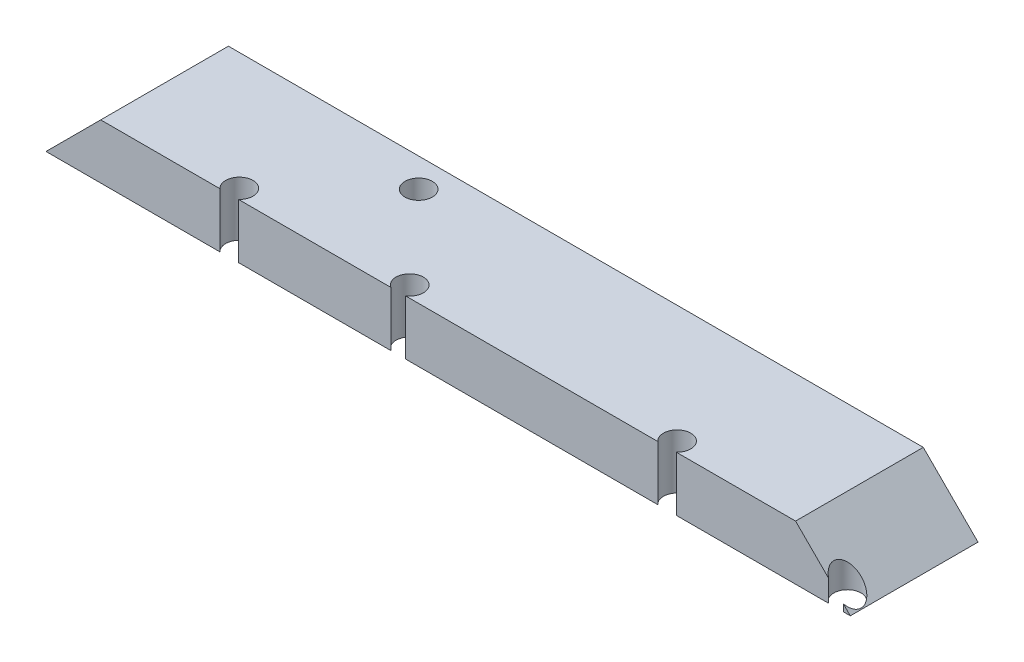
ISO-10303-21;
HEADER;
FILE_DESCRIPTION(('STEP AP214'),'2;1');
FILE_NAME('part.step','',(''),(''),'','','');
FILE_SCHEMA(('AUTOMOTIVE_DESIGN { 1 0 10303 214 1 1 1 1 }'));
ENDSEC;
DATA;
#1=APPLICATION_CONTEXT('core data for automotive mechanical design processes');
#2=APPLICATION_PROTOCOL_DEFINITION('international standard','automotive_design',2000,#1);
#3=PRODUCT_CONTEXT('',#1,'mechanical');
#4=PRODUCT('Part','Part','',(#3));
#5=PRODUCT_RELATED_PRODUCT_CATEGORY('part','',(#4));
#6=PRODUCT_DEFINITION_FORMATION('','',#4);
#7=PRODUCT_DEFINITION_CONTEXT('part definition',#1,'design');
#8=PRODUCT_DEFINITION('design','',#6,#7);
#9=PRODUCT_DEFINITION_SHAPE('','',#8);
#10=(LENGTH_UNIT() NAMED_UNIT(*) SI_UNIT(.MILLI.,.METRE.));
#11=(NAMED_UNIT(*) PLANE_ANGLE_UNIT() SI_UNIT($,.RADIAN.));
#12=(NAMED_UNIT(*) SI_UNIT($,.STERADIAN.) SOLID_ANGLE_UNIT());
#13=UNCERTAINTY_MEASURE_WITH_UNIT(LENGTH_MEASURE(1.E-05),#10,'distance_accuracy_value','');
#14=(GEOMETRIC_REPRESENTATION_CONTEXT(3) GLOBAL_UNCERTAINTY_ASSIGNED_CONTEXT((#13)) GLOBAL_UNIT_ASSIGNED_CONTEXT((#10,
#11,#12)) REPRESENTATION_CONTEXT('',''));
#15=CARTESIAN_POINT('',(0.,0.,0.));
#16=DIRECTION('',(0.,0.,1.));
#17=DIRECTION('',(1.,0.,0.));
#18=AXIS2_PLACEMENT_3D('',#15,#16,#17);
#19=CARTESIAN_POINT('',(0.,38.1,0.));
#20=DIRECTION('',(0.,0.,-1.));
#21=DIRECTION('',(-1.,0.,0.));
#22=AXIS2_PLACEMENT_3D('',#19,#20,#21);
#23=PLANE('',#22);
#24=DIRECTION('',(1.,0.,0.));
#25=VECTOR('',#24,1.);
#26=CARTESIAN_POINT('',(0.,0.,0.));
#27=LINE('',#26,#25);
#28=CARTESIAN_POINT('',(250.338601463434,0.,0.));
#29=VERTEX_POINT('',#28);
#30=CARTESIAN_POINT('',(425.940462477857,0.,0.));
#31=VERTEX_POINT('',#30);
#32=EDGE_CURVE('E171',#29,#31,#27,.T.);
#33=ORIENTED_EDGE('',*,*,#32,.T.);
#34=DIRECTION('',(0.,1.,0.));
#35=VECTOR('',#34,1.);
#36=CARTESIAN_POINT('',(425.940462477857,-0.001000000000001,0.));
#37=LINE('',#36,#35);
#38=CARTESIAN_POINT('',(425.940462477857,38.1,0.));
#39=VERTEX_POINT('',#38);
#40=EDGE_CURVE('E56',#39,#31,#37,.F.);
#41=ORIENTED_EDGE('',*,*,#40,.F.);
#42=DIRECTION('',(1.,0.,0.));
#43=VECTOR('',#42,1.);
#44=CARTESIAN_POINT('',(0.,38.1,0.));
#45=LINE('',#44,#43);
#46=CARTESIAN_POINT('',(250.338601463434,38.1,0.));
#47=VERTEX_POINT('',#46);
#48=EDGE_CURVE('E151',#47,#39,#45,.T.);
#49=ORIENTED_EDGE('',*,*,#48,.F.);
#50=DIRECTION('',(0.,1.,0.));
#51=VECTOR('',#50,1.);
#52=CARTESIAN_POINT('',(250.338601463434,-0.001000000000001,0.));
#53=LINE('',#52,#51);
#54=EDGE_CURVE('E196',#29,#47,#53,.T.);
#55=ORIENTED_EDGE('',*,*,#54,.F.);
#56=EDGE_LOOP('',(#33,#41,#49,#55));
#57=FACE_BOUND('',#56,.T.);
#58=ADVANCED_FACE('F31',(#57),#23,.F.);
#59=DIRECTION('',(0.,1.,0.));
#60=VECTOR('',#59,1.);
#61=CARTESIAN_POINT('',(544.861398536567,-0.001000000000001,0.));
#62=LINE('',#61,#60);
#63=CARTESIAN_POINT('',(544.861398536567,15.1386014634335,0.));
#64=VERTEX_POINT('',#63);
#65=CARTESIAN_POINT('',(544.861398536567,0.,0.));
#66=VERTEX_POINT('',#65);
#67=EDGE_CURVE('E200',#64,#66,#62,.F.);
#68=ORIENTED_EDGE('',*,*,#67,.F.);
#69=DIRECTION('',(0.707106781186548,-0.707106781186547,0.));
#70=VECTOR('',#69,1.);
#71=CARTESIAN_POINT('',(560.,0.,0.));
#72=LINE('',#71,#70);
#73=CARTESIAN_POINT('',(521.9,38.1,0.));
#74=VERTEX_POINT('',#73);
#75=EDGE_CURVE('E48',#74,#64,#72,.T.);
#76=ORIENTED_EDGE('',*,*,#75,.F.);
#77=CARTESIAN_POINT('',(438.859537522146,38.1,0.));
#78=VERTEX_POINT('',#77);
#79=EDGE_CURVE('E149',#78,#74,#45,.T.);
#80=ORIENTED_EDGE('',*,*,#79,.F.);
#81=DIRECTION('',(0.,1.,0.));
#82=VECTOR('',#81,1.);
#83=CARTESIAN_POINT('',(438.859537522146,-0.001000000000001,0.));
#84=LINE('',#83,#82);
#85=CARTESIAN_POINT('',(438.859537522146,0.,0.));
#86=VERTEX_POINT('',#85);
#87=EDGE_CURVE('E210',#86,#78,#84,.T.);
#88=ORIENTED_EDGE('',*,*,#87,.F.);
#89=EDGE_CURVE('E166',#86,#66,#27,.T.);
#90=ORIENTED_EDGE('',*,*,#89,.T.);
#91=EDGE_LOOP('',(#68,#76,#80,#88,#90));
#92=FACE_BOUND('',#91,.T.);
#93=ADVANCED_FACE('F241',(#92),#23,.F.);
#94=CARTESIAN_POINT('',(134.059537522143,0.,0.));
#95=VERTEX_POINT('',#94);
#96=CARTESIAN_POINT('',(240.061398536567,0.,0.));
#97=VERTEX_POINT('',#96);
#98=EDGE_CURVE('E164',#95,#97,#27,.T.);
#99=ORIENTED_EDGE('',*,*,#98,.T.);
#100=DIRECTION('',(0.,1.,0.));
#101=VECTOR('',#100,1.);
#102=CARTESIAN_POINT('',(240.061398536567,-0.001000000000001,0.));
#103=LINE('',#102,#101);
#104=CARTESIAN_POINT('',(240.061398536567,38.1,0.));
#105=VERTEX_POINT('',#104);
#106=EDGE_CURVE('E194',#105,#97,#103,.F.);
#107=ORIENTED_EDGE('',*,*,#106,.F.);
#108=CARTESIAN_POINT('',(134.059537522143,38.1,0.));
#109=VERTEX_POINT('',#108);
#110=EDGE_CURVE('E147',#109,#105,#45,.T.);
#111=ORIENTED_EDGE('',*,*,#110,.F.);
#112=DIRECTION('',(0.,1.,0.));
#113=VECTOR('',#112,1.);
#114=CARTESIAN_POINT('',(134.059537522143,-0.001000000000001,0.));
#115=LINE('',#114,#113);
#116=EDGE_CURVE('E179',#95,#109,#115,.T.);
#117=ORIENTED_EDGE('',*,*,#116,.F.);
#118=EDGE_LOOP('',(#99,#107,#111,#117));
#119=FACE_BOUND('',#118,.T.);
#120=ADVANCED_FACE('F262',(#119),#23,.F.);
#121=CARTESIAN_POINT('',(38.1,38.1,0.));
#122=VERTEX_POINT('',#121);
#123=CARTESIAN_POINT('',(121.140462477858,38.1,0.));
#124=VERTEX_POINT('',#123);
#125=EDGE_CURVE('E40',#122,#124,#45,.T.);
#126=ORIENTED_EDGE('',*,*,#125,.F.);
#127=DIRECTION('',(0.707106781186548,0.707106781186547,0.));
#128=VECTOR('',#127,1.);
#129=CARTESIAN_POINT('',(0.,0.,0.));
#130=LINE('',#129,#128);
#131=CARTESIAN_POINT('',(0.,0.,0.));
#132=VERTEX_POINT('',#131);
#133=EDGE_CURVE('E121',#132,#122,#130,.T.);
#134=ORIENTED_EDGE('',*,*,#133,.F.);
#135=CARTESIAN_POINT('',(121.140462477858,0.,0.));
#136=VERTEX_POINT('',#135);
#137=EDGE_CURVE('E162',#132,#136,#27,.T.);
#138=ORIENTED_EDGE('',*,*,#137,.T.);
#139=DIRECTION('',(0.,1.,0.));
#140=VECTOR('',#139,1.);
#141=CARTESIAN_POINT('',(121.140462477858,-0.001000000000001,0.));
#142=LINE('',#141,#140);
#143=EDGE_CURVE('E146',#124,#136,#142,.F.);
#144=ORIENTED_EDGE('',*,*,#143,.F.);
#145=EDGE_LOOP('',(#126,#134,#138,#144));
#146=FACE_BOUND('',#145,.T.);
#147=ADVANCED_FACE('F145',(#146),#23,.F.);
#148=CARTESIAN_POINT('',(555.138601463434,0.,0.));
#149=VERTEX_POINT('',#148);
#150=CARTESIAN_POINT('',(560.,0.,0.));
#151=VERTEX_POINT('',#150);
#152=EDGE_CURVE('E168',#149,#151,#27,.T.);
#153=ORIENTED_EDGE('',*,*,#152,.T.);
#154=DIRECTION('',(0.707106781186548,-0.707106781186547,0.));
#155=VECTOR('',#154,1.);
#156=CARTESIAN_POINT('',(560.,0.,0.));
#157=LINE('',#156,#155);
#158=CARTESIAN_POINT('',(555.138601463434,4.86139853656653,0.));
#159=VERTEX_POINT('',#158);
#160=EDGE_CURVE('E213',#159,#151,#157,.T.);
#161=ORIENTED_EDGE('',*,*,#160,.F.);
#162=DIRECTION('',(0.,1.,0.));
#163=VECTOR('',#162,1.);
#164=CARTESIAN_POINT('',(555.138601463434,-0.001000000000001,0.));
#165=LINE('',#164,#163);
#166=EDGE_CURVE('E202',#149,#159,#165,.T.);
#167=ORIENTED_EDGE('',*,*,#166,.F.);
#168=EDGE_LOOP('',(#153,#161,#167));
#169=FACE_BOUND('',#168,.T.);
#170=ADVANCED_FACE('F33',(#169),#23,.F.);
#171=CARTESIAN_POINT('',(0.,38.1,-88.9));
#172=DIRECTION('',(0.,0.,1.));
#173=DIRECTION('',(1.,0.,0.));
#174=AXIS2_PLACEMENT_3D('',#171,#172,#173);
#175=PLANE('',#174);
#176=DIRECTION('',(-1.,0.,0.));
#177=VECTOR('',#176,1.);
#178=CARTESIAN_POINT('',(0.,0.,-88.9));
#179=LINE('',#178,#177);
#180=CARTESIAN_POINT('',(560.,0.,-88.9));
#181=VERTEX_POINT('',#180);
#182=CARTESIAN_POINT('',(0.,0.,-88.9));
#183=VERTEX_POINT('',#182);
#184=EDGE_CURVE('E35',#181,#183,#179,.T.);
#185=ORIENTED_EDGE('',*,*,#184,.T.);
#186=DIRECTION('',(-0.707106781186548,-0.707106781186547,0.));
#187=VECTOR('',#186,1.);
#188=CARTESIAN_POINT('',(0.,0.,-88.9));
#189=LINE('',#188,#187);
#190=CARTESIAN_POINT('',(38.1,38.1,-88.9));
#191=VERTEX_POINT('',#190);
#192=EDGE_CURVE('E142',#191,#183,#189,.T.);
#193=ORIENTED_EDGE('',*,*,#192,.F.);
#194=DIRECTION('',(-1.,0.,0.));
#195=VECTOR('',#194,1.);
#196=CARTESIAN_POINT('',(0.,38.1,-88.9));
#197=LINE('',#196,#195);
#198=CARTESIAN_POINT('',(521.9,38.1,-88.9));
#199=VERTEX_POINT('',#198);
#200=EDGE_CURVE('E11',#199,#191,#197,.T.);
#201=ORIENTED_EDGE('',*,*,#200,.F.);
#202=DIRECTION('',(-0.707106781186548,0.707106781186547,0.));
#203=VECTOR('',#202,1.);
#204=CARTESIAN_POINT('',(560.,0.,-88.9));
#205=LINE('',#204,#203);
#206=EDGE_CURVE('E132',#181,#199,#205,.T.);
#207=ORIENTED_EDGE('',*,*,#206,.F.);
#208=EDGE_LOOP('',(#185,#193,#201,#207));
#209=FACE_BOUND('',#208,.T.);
#210=ADVANCED_FACE('F222',(#209),#175,.F.);
#211=CARTESIAN_POINT('',(0.,38.1,0.));
#212=DIRECTION('',(0.,1.,0.));
#213=DIRECTION('',(0.,0.,1.));
#214=AXIS2_PLACEMENT_3D('',#211,#212,#213);
#215=PLANE('',#214);
#216=DIRECTION('',(0.,0.,-1.));
#217=VECTOR('',#216,1.);
#218=CARTESIAN_POINT('',(38.1,38.1,0.001000000000001));
#219=LINE('',#218,#217);
#220=EDGE_CURVE('E124',#122,#191,#219,.T.);
#221=ORIENTED_EDGE('',*,*,#220,.F.);
#222=ORIENTED_EDGE('',*,*,#125,.T.);
#223=CARTESIAN_POINT('',(127.6,38.1,-7.00000000000214));
#224=DIRECTION('',(0.,1.,0.));
#225=DIRECTION('',(0.,0.,1.));
#226=AXIS2_PLACEMENT_3D('',#223,#224,#225);
#227=CIRCLE('',#226,9.525);
#228=EDGE_CURVE('E172',#109,#124,#227,.T.);
#229=ORIENTED_EDGE('',*,*,#228,.F.);
#230=ORIENTED_EDGE('',*,*,#110,.T.);
#231=CARTESIAN_POINT('',(245.2,38.1,-8.02));
#232=DIRECTION('',(0.,1.,0.));
#233=DIRECTION('',(0.,0.,1.));
#234=AXIS2_PLACEMENT_3D('',#231,#232,#233);
#235=CIRCLE('',#234,9.52499999999999);
#236=EDGE_CURVE('E192',#47,#105,#235,.T.);
#237=ORIENTED_EDGE('',*,*,#236,.F.);
#238=ORIENTED_EDGE('',*,*,#48,.T.);
#239=CARTESIAN_POINT('',(432.400000000001,38.1,-7.00000000000059));
#240=DIRECTION('',(0.,1.,0.));
#241=DIRECTION('',(0.,0.,1.));
#242=AXIS2_PLACEMENT_3D('',#239,#240,#241);
#243=CIRCLE('',#242,9.52500000000002);
#244=EDGE_CURVE('E207',#78,#39,#243,.T.);
#245=ORIENTED_EDGE('',*,*,#244,.F.);
#246=ORIENTED_EDGE('',*,*,#79,.T.);
#247=DIRECTION('',(0.,0.,-1.));
#248=VECTOR('',#247,1.);
#249=CARTESIAN_POINT('',(521.9,38.1,0.001000000000001));
#250=LINE('',#249,#248);
#251=EDGE_CURVE('E217',#74,#199,#250,.T.);
#252=ORIENTED_EDGE('',*,*,#251,.T.);
#253=ORIENTED_EDGE('',*,*,#200,.T.);
#254=EDGE_LOOP('',(#221,#222,#229,#230,#237,#238,#245,#246,#252,#253));
#255=FACE_BOUND('',#254,.T.);
#256=CARTESIAN_POINT('',(190.57,38.1,-68.87));
#257=DIRECTION('',(0.,1.,0.));
#258=DIRECTION('',(0.,0.,1.));
#259=AXIS2_PLACEMENT_3D('',#256,#257,#258);
#260=CIRCLE('',#259,9.525);
#261=CARTESIAN_POINT('',(190.57,38.1,-59.345));
#262=VERTEX_POINT('',#261);
#263=EDGE_CURVE('E184',#262,#262,#260,.T.);
#264=ORIENTED_EDGE('',*,*,#263,.F.);
#265=EDGE_LOOP('',(#264));
#266=FACE_BOUND('',#265,.T.);
#267=ADVANCED_FACE('F136',(#255,#266),#215,.T.);
#268=CARTESIAN_POINT('',(0.,0.,0.));
#269=DIRECTION('',(0.,1.,0.));
#270=DIRECTION('',(0.,0.,1.));
#271=AXIS2_PLACEMENT_3D('',#268,#269,#270);
#272=PLANE('',#271);
#273=CARTESIAN_POINT('',(10.0000000000002,0.,-68.87));
#274=DIRECTION('',(0.,1.,0.));
#275=DIRECTION('',(0.,0.,1.));
#276=AXIS2_PLACEMENT_3D('',#273,#274,#275);
#277=CIRCLE('',#276,9.525);
#278=CARTESIAN_POINT('',(10.0000000000002,0.,-59.345));
#279=VERTEX_POINT('',#278);
#280=EDGE_CURVE('E187',#279,#279,#277,.F.);
#281=ORIENTED_EDGE('',*,*,#280,.F.);
#282=EDGE_LOOP('',(#281));
#283=FACE_BOUND('',#282,.T.);
#284=CARTESIAN_POINT('',(190.57,0.,-68.87));
#285=DIRECTION('',(0.,1.,0.));
#286=DIRECTION('',(0.,0.,1.));
#287=AXIS2_PLACEMENT_3D('',#284,#285,#286);
#288=CIRCLE('',#287,9.525);
#289=CARTESIAN_POINT('',(190.57,0.,-59.345));
#290=VERTEX_POINT('',#289);
#291=EDGE_CURVE('E181',#290,#290,#288,.F.);
#292=ORIENTED_EDGE('',*,*,#291,.F.);
#293=EDGE_LOOP('',(#292));
#294=FACE_BOUND('',#293,.T.);
#295=ORIENTED_EDGE('',*,*,#89,.F.);
#296=CARTESIAN_POINT('',(432.400000000001,0.,-7.00000000000059));
#297=DIRECTION('',(0.,1.,0.));
#298=DIRECTION('',(0.,0.,1.));
#299=AXIS2_PLACEMENT_3D('',#296,#297,#298);
#300=CIRCLE('',#299,9.52500000000002);
#301=EDGE_CURVE('E205',#31,#86,#300,.F.);
#302=ORIENTED_EDGE('',*,*,#301,.F.);
#303=ORIENTED_EDGE('',*,*,#32,.F.);
#304=CARTESIAN_POINT('',(245.2,0.,-8.02));
#305=DIRECTION('',(0.,1.,0.));
#306=DIRECTION('',(0.,0.,1.));
#307=AXIS2_PLACEMENT_3D('',#304,#305,#306);
#308=CIRCLE('',#307,9.52499999999999);
#309=EDGE_CURVE('E190',#97,#29,#308,.F.);
#310=ORIENTED_EDGE('',*,*,#309,.F.);
#311=ORIENTED_EDGE('',*,*,#98,.F.);
#312=CARTESIAN_POINT('',(127.6,0.,-7.00000000000214));
#313=DIRECTION('',(0.,1.,0.));
#314=DIRECTION('',(0.,0.,1.));
#315=AXIS2_PLACEMENT_3D('',#312,#313,#314);
#316=CIRCLE('',#315,9.525);
#317=EDGE_CURVE('E169',#136,#95,#316,.F.);
#318=ORIENTED_EDGE('',*,*,#317,.F.);
#319=ORIENTED_EDGE('',*,*,#137,.F.);
#320=DIRECTION('',(0.,0.,1.));
#321=VECTOR('',#320,1.);
#322=CARTESIAN_POINT('',(0.,0.,-88.9));
#323=LINE('',#322,#321);
#324=EDGE_CURVE('E127',#183,#132,#323,.T.);
#325=ORIENTED_EDGE('',*,*,#324,.F.);
#326=ORIENTED_EDGE('',*,*,#184,.F.);
#327=DIRECTION('',(0.,0.,-1.));
#328=VECTOR('',#327,1.);
#329=CARTESIAN_POINT('',(560.,0.,-88.9));
#330=LINE('',#329,#328);
#331=EDGE_CURVE('E158',#151,#181,#330,.T.);
#332=ORIENTED_EDGE('',*,*,#331,.F.);
#333=ORIENTED_EDGE('',*,*,#152,.F.);
#334=CARTESIAN_POINT('',(550.,0.,-8.02));
#335=DIRECTION('',(0.,1.,0.));
#336=DIRECTION('',(0.,0.,1.));
#337=AXIS2_PLACEMENT_3D('',#334,#335,#336);
#338=CIRCLE('',#337,9.52500000000002);
#339=EDGE_CURVE('E198',#66,#149,#338,.F.);
#340=ORIENTED_EDGE('',*,*,#339,.F.);
#341=EDGE_LOOP('',(#295,#302,#303,#310,#311,#318,#319,#325,#326,#332,#333,#340));
#342=FACE_BOUND('',#341,.T.);
#343=ADVANCED_FACE('F225',(#283,#294,#342),#272,.F.);
#344=CARTESIAN_POINT('',(127.6,-0.001000000000001,-7.00000000000214));
#345=DIRECTION('',(0.,1.,0.));
#346=DIRECTION('',(0.,0.,1.));
#347=AXIS2_PLACEMENT_3D('',#344,#345,#346);
#348=CYLINDRICAL_SURFACE('',#347,9.525);
#349=ORIENTED_EDGE('',*,*,#143,.T.);
#350=ORIENTED_EDGE('',*,*,#317,.T.);
#351=ORIENTED_EDGE('',*,*,#116,.T.);
#352=ORIENTED_EDGE('',*,*,#228,.T.);
#353=EDGE_LOOP('',(#349,#350,#351,#352));
#354=FACE_BOUND('',#353,.T.);
#355=ADVANCED_FACE('F314',(#354),#348,.F.);
#356=CARTESIAN_POINT('',(190.57,-0.001000000000001,-68.87));
#357=DIRECTION('',(0.,1.,0.));
#358=DIRECTION('',(0.,0.,1.));
#359=AXIS2_PLACEMENT_3D('',#356,#357,#358);
#360=CYLINDRICAL_SURFACE('',#359,9.525);
#361=ORIENTED_EDGE('',*,*,#263,.T.);
#362=EDGE_LOOP('',(#361));
#363=FACE_BOUND('',#362,.T.);
#364=ORIENTED_EDGE('',*,*,#291,.T.);
#365=EDGE_LOOP('',(#364));
#366=FACE_BOUND('',#365,.T.);
#367=ADVANCED_FACE('F327',(#363,#366),#360,.F.);
#368=CARTESIAN_POINT('',(10.0000000000002,-0.001000000000001,-68.87));
#369=DIRECTION('',(0.,1.,0.));
#370=DIRECTION('',(0.,0.,1.));
#371=AXIS2_PLACEMENT_3D('',#368,#369,#370);
#372=CYLINDRICAL_SURFACE('',#371,9.525);
#373=CARTESIAN_POINT('',(10.0000000000002,10.0000000000002,-68.87));
#374=DIRECTION('',(0.707106781186547,-0.707106781186548,0.));
#375=DIRECTION('',(0.707106781186548,0.707106781186547,0.));
#376=AXIS2_PLACEMENT_3D('',#373,#374,#375);
#377=ELLIPSE('',#376,13.4703841816037,9.525);
#378=CARTESIAN_POINT('',(19.5250000000002,19.5250000000002,-68.87));
#379=VERTEX_POINT('',#378);
#380=EDGE_CURVE('E133',#379,#379,#377,.T.);
#381=ORIENTED_EDGE('',*,*,#380,.F.);
#382=EDGE_LOOP('',(#381));
#383=FACE_BOUND('',#382,.T.);
#384=ORIENTED_EDGE('',*,*,#280,.T.);
#385=EDGE_LOOP('',(#384));
#386=FACE_BOUND('',#385,.T.);
#387=ADVANCED_FACE('F321',(#383,#386),#372,.F.);
#388=CARTESIAN_POINT('',(245.2,-0.001000000000001,-8.02));
#389=DIRECTION('',(0.,1.,0.));
#390=DIRECTION('',(0.,0.,1.));
#391=AXIS2_PLACEMENT_3D('',#388,#389,#390);
#392=CYLINDRICAL_SURFACE('',#391,9.52499999999999);
#393=ORIENTED_EDGE('',*,*,#106,.T.);
#394=ORIENTED_EDGE('',*,*,#309,.T.);
#395=ORIENTED_EDGE('',*,*,#54,.T.);
#396=ORIENTED_EDGE('',*,*,#236,.T.);
#397=EDGE_LOOP('',(#393,#394,#395,#396));
#398=FACE_BOUND('',#397,.T.);
#399=ADVANCED_FACE('F326',(#398),#392,.F.);
#400=CARTESIAN_POINT('',(550.,-0.001000000000001,-8.02));
#401=DIRECTION('',(0.,1.,0.));
#402=DIRECTION('',(0.,0.,1.));
#403=AXIS2_PLACEMENT_3D('',#400,#401,#402);
#404=CYLINDRICAL_SURFACE('',#403,9.52500000000002);
#405=ORIENTED_EDGE('',*,*,#166,.T.);
#406=CARTESIAN_POINT('',(550.,10.,-8.02));
#407=DIRECTION('',(-0.707106781186547,-0.707106781186548,0.));
#408=DIRECTION('',(-0.707106781186548,0.707106781186547,0.));
#409=AXIS2_PLACEMENT_3D('',#406,#407,#408);
#410=ELLIPSE('',#409,13.4703841816038,9.52500000000002);
#411=EDGE_CURVE('E215',#64,#159,#410,.T.);
#412=ORIENTED_EDGE('',*,*,#411,.F.);
#413=ORIENTED_EDGE('',*,*,#67,.T.);
#414=ORIENTED_EDGE('',*,*,#339,.T.);
#415=EDGE_LOOP('',(#405,#412,#413,#414));
#416=FACE_BOUND('',#415,.T.);
#417=ADVANCED_FACE('F244',(#416),#404,.F.);
#418=CARTESIAN_POINT('',(432.400000000001,-0.001000000000001,-7.00000000000059));
#419=DIRECTION('',(0.,1.,0.));
#420=DIRECTION('',(0.,0.,1.));
#421=AXIS2_PLACEMENT_3D('',#418,#419,#420);
#422=CYLINDRICAL_SURFACE('',#421,9.52500000000002);
#423=ORIENTED_EDGE('',*,*,#40,.T.);
#424=ORIENTED_EDGE('',*,*,#301,.T.);
#425=ORIENTED_EDGE('',*,*,#87,.T.);
#426=ORIENTED_EDGE('',*,*,#244,.T.);
#427=EDGE_LOOP('',(#423,#424,#425,#426));
#428=FACE_BOUND('',#427,.T.);
#429=ADVANCED_FACE('F249',(#428),#422,.F.);
#430=CARTESIAN_POINT('',(560.,0.,0.001000000000001));
#431=DIRECTION('',(-0.707106781186547,-0.707106781186548,0.));
#432=DIRECTION('',(0.707106781186548,-0.707106781186547,0.));
#433=AXIS2_PLACEMENT_3D('',#430,#431,#432);
#434=PLANE('',#433);
#435=ORIENTED_EDGE('',*,*,#75,.T.);
#436=ORIENTED_EDGE('',*,*,#411,.T.);
#437=ORIENTED_EDGE('',*,*,#160,.T.);
#438=ORIENTED_EDGE('',*,*,#331,.T.);
#439=ORIENTED_EDGE('',*,*,#206,.T.);
#440=ORIENTED_EDGE('',*,*,#251,.F.);
#441=EDGE_LOOP('',(#435,#436,#437,#438,#439,#440));
#442=FACE_BOUND('',#441,.T.);
#443=ADVANCED_FACE('F247',(#442),#434,.F.);
#444=CARTESIAN_POINT('',(0.,0.,0.001000000000001));
#445=DIRECTION('',(0.707106781186547,-0.707106781186548,0.));
#446=DIRECTION('',(0.707106781186548,0.707106781186547,0.));
#447=AXIS2_PLACEMENT_3D('',#444,#445,#446);
#448=PLANE('',#447);
#449=ORIENTED_EDGE('',*,*,#380,.T.);
#450=EDGE_LOOP('',(#449));
#451=FACE_BOUND('',#450,.T.);
#452=ORIENTED_EDGE('',*,*,#133,.T.);
#453=ORIENTED_EDGE('',*,*,#220,.T.);
#454=ORIENTED_EDGE('',*,*,#192,.T.);
#455=ORIENTED_EDGE('',*,*,#324,.T.);
#456=EDGE_LOOP('',(#452,#453,#454,#455));
#457=FACE_BOUND('',#456,.T.);
#458=ADVANCED_FACE('F123',(#451,#457),#448,.F.);
#459=CLOSED_SHELL('',(#58,#93,#120,#147,#170,#210,#267,#343,#355,#367,#387,#399,#417,#429,#443,#458));
#460=MANIFOLD_SOLID_BREP('B2',#459);
#461=ADVANCED_BREP_SHAPE_REPRESENTATION('',(#18,#460),#14);
#462=SHAPE_DEFINITION_REPRESENTATION(#9,#461);
ENDSEC;
END-ISO-10303-21;
